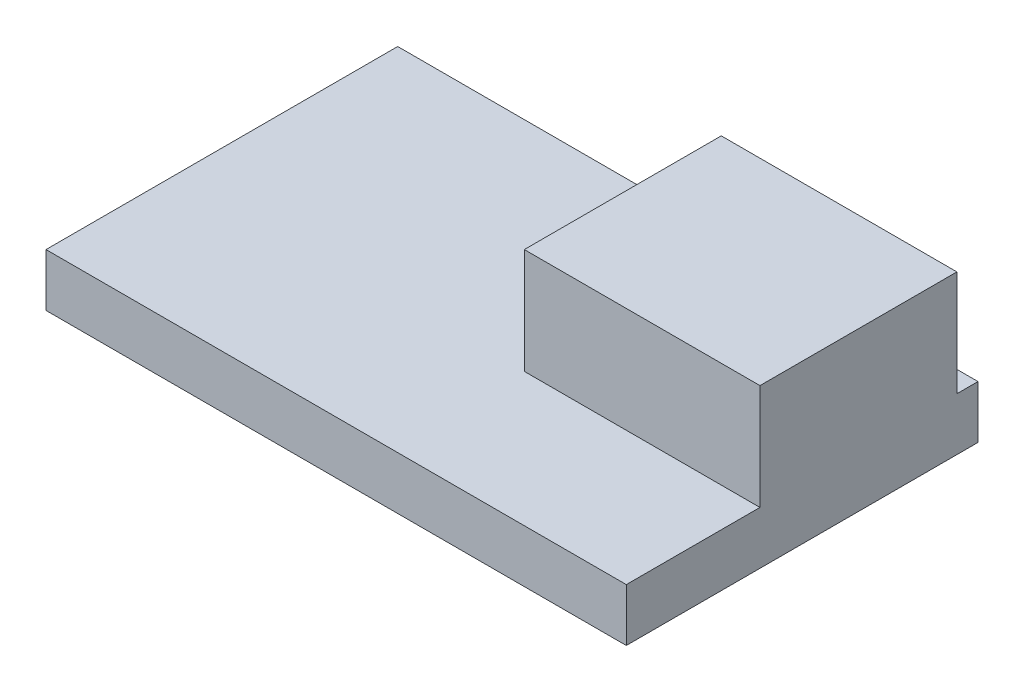
ISO-10303-21;
HEADER;
FILE_DESCRIPTION(('STEP AP214'),'2;1');
FILE_NAME('part.step','',(''),(''),'','','');
FILE_SCHEMA(('AUTOMOTIVE_DESIGN { 1 0 10303 214 1 1 1 1 }'));
ENDSEC;
DATA;
#1=APPLICATION_CONTEXT('core data for automotive mechanical design processes');
#2=APPLICATION_PROTOCOL_DEFINITION('international standard','automotive_design',2000,#1);
#3=PRODUCT_CONTEXT('',#1,'mechanical');
#4=PRODUCT('Part','Part','',(#3));
#5=PRODUCT_RELATED_PRODUCT_CATEGORY('part','',(#4));
#6=PRODUCT_DEFINITION_FORMATION('','',#4);
#7=PRODUCT_DEFINITION_CONTEXT('part definition',#1,'design');
#8=PRODUCT_DEFINITION('design','',#6,#7);
#9=PRODUCT_DEFINITION_SHAPE('','',#8);
#10=(LENGTH_UNIT() NAMED_UNIT(*) SI_UNIT(.MILLI.,.METRE.));
#11=(NAMED_UNIT(*) PLANE_ANGLE_UNIT() SI_UNIT($,.RADIAN.));
#12=(NAMED_UNIT(*) SI_UNIT($,.STERADIAN.) SOLID_ANGLE_UNIT());
#13=UNCERTAINTY_MEASURE_WITH_UNIT(LENGTH_MEASURE(1.E-05),#10,'distance_accuracy_value','');
#14=(GEOMETRIC_REPRESENTATION_CONTEXT(3) GLOBAL_UNCERTAINTY_ASSIGNED_CONTEXT((#13)) GLOBAL_UNIT_ASSIGNED_CONTEXT((#10,
#11,#12)) REPRESENTATION_CONTEXT('',''));
#15=CARTESIAN_POINT('',(0.,0.,0.));
#16=DIRECTION('',(0.,0.,1.));
#17=DIRECTION('',(1.,0.,0.));
#18=AXIS2_PLACEMENT_3D('',#15,#16,#17);
#19=CARTESIAN_POINT('',(-22.7791116446579,45.,-23.3733493397359));
#20=DIRECTION('',(1.,0.,0.));
#21=DIRECTION('',(0.,0.,-1.));
#22=AXIS2_PLACEMENT_3D('',#19,#20,#21);
#23=PLANE('',#22);
#24=DIRECTION('',(0.,0.,1.));
#25=VECTOR('',#24,1.);
#26=CARTESIAN_POINT('',(-22.7791116446579,15.,0.));
#27=LINE('',#26,#25);
#28=CARTESIAN_POINT('',(-22.7791116446579,15.,-23.3733493397359));
#29=VERTEX_POINT('',#28);
#30=CARTESIAN_POINT('',(-22.7791116446579,15.,76.6266506602641));
#31=VERTEX_POINT('',#30);
#32=EDGE_CURVE('E133',#29,#31,#27,.T.);
#33=ORIENTED_EDGE('',*,*,#32,.F.);
#34=DIRECTION('',(0.,-1.,0.));
#35=VECTOR('',#34,1.);
#36=CARTESIAN_POINT('',(-22.7791116446579,45.,-23.3733493397359));
#37=LINE('',#36,#35);
#38=CARTESIAN_POINT('',(-22.7791116446579,0.,-23.3733493397359));
#39=VERTEX_POINT('',#38);
#40=EDGE_CURVE('E60',#29,#39,#37,.T.);
#41=ORIENTED_EDGE('',*,*,#40,.T.);
#42=DIRECTION('',(0.,0.,1.));
#43=VECTOR('',#42,1.);
#44=CARTESIAN_POINT('',(-22.7791116446579,0.,-23.3733493397359));
#45=LINE('',#44,#43);
#46=CARTESIAN_POINT('',(-22.7791116446579,0.,76.6266506602641));
#47=VERTEX_POINT('',#46);
#48=EDGE_CURVE('E141',#39,#47,#45,.T.);
#49=ORIENTED_EDGE('',*,*,#48,.T.);
#50=DIRECTION('',(0.,-1.,0.));
#51=VECTOR('',#50,1.);
#52=CARTESIAN_POINT('',(-22.7791116446579,45.,76.6266506602641));
#53=LINE('',#52,#51);
#54=EDGE_CURVE('E11',#31,#47,#53,.T.);
#55=ORIENTED_EDGE('',*,*,#54,.F.);
#56=EDGE_LOOP('',(#33,#41,#49,#55));
#57=FACE_BOUND('',#56,.T.);
#58=ADVANCED_FACE('F38',(#57),#23,.F.);
#59=CARTESIAN_POINT('',(-22.7791116446579,45.,76.6266506602641));
#60=DIRECTION('',(0.,0.,-1.));
#61=DIRECTION('',(-1.,0.,0.));
#62=AXIS2_PLACEMENT_3D('',#59,#60,#61);
#63=PLANE('',#62);
#64=DIRECTION('',(1.,0.,0.));
#65=VECTOR('',#64,1.);
#66=CARTESIAN_POINT('',(0.,15.,76.6266506602641));
#67=LINE('',#66,#65);
#68=CARTESIAN_POINT('',(142.220888355342,15.,76.6266506602641));
#69=VERTEX_POINT('',#68);
#70=EDGE_CURVE('E135',#31,#69,#67,.T.);
#71=ORIENTED_EDGE('',*,*,#70,.F.);
#72=ORIENTED_EDGE('',*,*,#54,.T.);
#73=DIRECTION('',(1.,0.,0.));
#74=VECTOR('',#73,1.);
#75=CARTESIAN_POINT('',(-22.7791116446579,0.,76.6266506602641));
#76=LINE('',#75,#74);
#77=CARTESIAN_POINT('',(142.220888355342,0.,76.6266506602641));
#78=VERTEX_POINT('',#77);
#79=EDGE_CURVE('E151',#47,#78,#76,.T.);
#80=ORIENTED_EDGE('',*,*,#79,.T.);
#81=DIRECTION('',(0.,-1.,0.));
#82=VECTOR('',#81,1.);
#83=CARTESIAN_POINT('',(142.220888355342,45.,76.6266506602641));
#84=LINE('',#83,#82);
#85=EDGE_CURVE('E45',#69,#78,#84,.T.);
#86=ORIENTED_EDGE('',*,*,#85,.F.);
#87=EDGE_LOOP('',(#71,#72,#80,#86));
#88=FACE_BOUND('',#87,.T.);
#89=ADVANCED_FACE('F169',(#88),#63,.F.);
#90=CARTESIAN_POINT('',(142.220888355342,45.,-23.3733493397359));
#91=DIRECTION('',(-1.,0.,0.));
#92=DIRECTION('',(0.,0.,1.));
#93=AXIS2_PLACEMENT_3D('',#90,#91,#92);
#94=PLANE('',#93);
#95=DIRECTION('',(0.,1.,0.));
#96=VECTOR('',#95,1.);
#97=CARTESIAN_POINT('',(142.220888355342,15.,38.6266506602641));
#98=LINE('',#97,#96);
#99=CARTESIAN_POINT('',(142.220888355342,15.,38.6266506602641));
#100=VERTEX_POINT('',#99);
#101=CARTESIAN_POINT('',(142.220888355342,45.,38.6266506602641));
#102=VERTEX_POINT('',#101);
#103=EDGE_CURVE('E139',#100,#102,#98,.T.);
#104=ORIENTED_EDGE('',*,*,#103,.F.);
#105=DIRECTION('',(0.,0.,-1.));
#106=VECTOR('',#105,1.);
#107=CARTESIAN_POINT('',(142.220888355342,15.,0.));
#108=LINE('',#107,#106);
#109=EDGE_CURVE('E118',#69,#100,#108,.T.);
#110=ORIENTED_EDGE('',*,*,#109,.F.);
#111=ORIENTED_EDGE('',*,*,#85,.T.);
#112=DIRECTION('',(0.,0.,-1.));
#113=VECTOR('',#112,1.);
#114=CARTESIAN_POINT('',(142.220888355342,0.,-23.3733493397359));
#115=LINE('',#114,#113);
#116=CARTESIAN_POINT('',(142.220888355342,0.,-23.3733493397359));
#117=VERTEX_POINT('',#116);
#118=EDGE_CURVE('E154',#78,#117,#115,.T.);
#119=ORIENTED_EDGE('',*,*,#118,.T.);
#120=DIRECTION('',(0.,-1.,0.));
#121=VECTOR('',#120,1.);
#122=CARTESIAN_POINT('',(142.220888355342,45.,-23.3733493397359));
#123=LINE('',#122,#121);
#124=CARTESIAN_POINT('',(142.220888355342,15.,-23.3733493397359));
#125=VERTEX_POINT('',#124);
#126=EDGE_CURVE('E159',#125,#117,#123,.T.);
#127=ORIENTED_EDGE('',*,*,#126,.F.);
#128=CARTESIAN_POINT('',(142.220888355342,15.,-17.3733493397359));
#129=VERTEX_POINT('',#128);
#130=EDGE_CURVE('E129',#129,#125,#108,.T.);
#131=ORIENTED_EDGE('',*,*,#130,.F.);
#132=DIRECTION('',(0.,1.,0.));
#133=VECTOR('',#132,1.);
#134=CARTESIAN_POINT('',(142.220888355342,15.,-17.3733493397359));
#135=LINE('',#134,#133);
#136=CARTESIAN_POINT('',(142.220888355342,45.,-17.3733493397359));
#137=VERTEX_POINT('',#136);
#138=EDGE_CURVE('E142',#129,#137,#135,.T.);
#139=ORIENTED_EDGE('',*,*,#138,.T.);
#140=DIRECTION('',(0.,0.,-1.));
#141=VECTOR('',#140,1.);
#142=CARTESIAN_POINT('',(142.220888355342,45.,-23.3733493397359));
#143=LINE('',#142,#141);
#144=EDGE_CURVE('E146',#102,#137,#143,.T.);
#145=ORIENTED_EDGE('',*,*,#144,.F.);
#146=EDGE_LOOP('',(#104,#110,#111,#119,#127,#131,#139,#145));
#147=FACE_BOUND('',#146,.T.);
#148=ADVANCED_FACE('F162',(#147),#94,.F.);
#149=CARTESIAN_POINT('',(-22.7791116446579,45.,-23.3733493397359));
#150=DIRECTION('',(0.,0.,1.));
#151=DIRECTION('',(1.,0.,0.));
#152=AXIS2_PLACEMENT_3D('',#149,#150,#151);
#153=PLANE('',#152);
#154=DIRECTION('',(-1.,0.,0.));
#155=VECTOR('',#154,1.);
#156=CARTESIAN_POINT('',(0.,15.,-23.3733493397359));
#157=LINE('',#156,#155);
#158=EDGE_CURVE('E131',#125,#29,#157,.T.);
#159=ORIENTED_EDGE('',*,*,#158,.F.);
#160=ORIENTED_EDGE('',*,*,#126,.T.);
#161=DIRECTION('',(-1.,0.,0.));
#162=VECTOR('',#161,1.);
#163=CARTESIAN_POINT('',(-22.7791116446579,0.,-23.3733493397359));
#164=LINE('',#163,#162);
#165=EDGE_CURVE('E149',#117,#39,#164,.T.);
#166=ORIENTED_EDGE('',*,*,#165,.T.);
#167=ORIENTED_EDGE('',*,*,#40,.F.);
#168=EDGE_LOOP('',(#159,#160,#166,#167));
#169=FACE_BOUND('',#168,.T.);
#170=ADVANCED_FACE('F176',(#169),#153,.F.);
#171=CARTESIAN_POINT('',(0.,45.,0.));
#172=DIRECTION('',(0.,1.,0.));
#173=DIRECTION('',(0.,0.,1.));
#174=AXIS2_PLACEMENT_3D('',#171,#172,#173);
#175=PLANE('',#174);
#176=DIRECTION('',(0.,0.,1.));
#177=VECTOR('',#176,1.);
#178=CARTESIAN_POINT('',(75.2208883553421,45.,0.));
#179=LINE('',#178,#177);
#180=CARTESIAN_POINT('',(75.2208883553421,45.,-17.3733493397359));
#181=VERTEX_POINT('',#180);
#182=CARTESIAN_POINT('',(75.2208883553421,45.,38.6266506602641));
#183=VERTEX_POINT('',#182);
#184=EDGE_CURVE('E125',#181,#183,#179,.T.);
#185=ORIENTED_EDGE('',*,*,#184,.T.);
#186=DIRECTION('',(1.,0.,0.));
#187=VECTOR('',#186,1.);
#188=CARTESIAN_POINT('',(0.,45.,38.6266506602641));
#189=LINE('',#188,#187);
#190=EDGE_CURVE('E52',#183,#102,#189,.T.);
#191=ORIENTED_EDGE('',*,*,#190,.T.);
#192=ORIENTED_EDGE('',*,*,#144,.T.);
#193=DIRECTION('',(1.,0.,0.));
#194=VECTOR('',#193,1.);
#195=CARTESIAN_POINT('',(0.,45.,-17.3733493397359));
#196=LINE('',#195,#194);
#197=EDGE_CURVE('E123',#181,#137,#196,.T.);
#198=ORIENTED_EDGE('',*,*,#197,.F.);
#199=EDGE_LOOP('',(#185,#191,#192,#198));
#200=FACE_BOUND('',#199,.T.);
#201=ADVANCED_FACE('F183',(#200),#175,.T.);
#202=CARTESIAN_POINT('',(0.,0.,0.));
#203=DIRECTION('',(0.,1.,0.));
#204=DIRECTION('',(0.,0.,1.));
#205=AXIS2_PLACEMENT_3D('',#202,#203,#204);
#206=PLANE('',#205);
#207=ORIENTED_EDGE('',*,*,#48,.F.);
#208=ORIENTED_EDGE('',*,*,#165,.F.);
#209=ORIENTED_EDGE('',*,*,#118,.F.);
#210=ORIENTED_EDGE('',*,*,#79,.F.);
#211=EDGE_LOOP('',(#207,#208,#209,#210));
#212=FACE_BOUND('',#211,.T.);
#213=ADVANCED_FACE('F173',(#212),#206,.F.);
#214=CARTESIAN_POINT('',(0.,15.,38.6266506602641));
#215=DIRECTION('',(0.,0.,1.));
#216=DIRECTION('',(1.,0.,0.));
#217=AXIS2_PLACEMENT_3D('',#214,#215,#216);
#218=PLANE('',#217);
#219=ORIENTED_EDGE('',*,*,#190,.F.);
#220=DIRECTION('',(0.,1.,0.));
#221=VECTOR('',#220,1.);
#222=CARTESIAN_POINT('',(75.2208883553421,15.,38.6266506602641));
#223=LINE('',#222,#221);
#224=CARTESIAN_POINT('',(75.2208883553421,15.,38.6266506602641));
#225=VERTEX_POINT('',#224);
#226=EDGE_CURVE('E106',#225,#183,#223,.T.);
#227=ORIENTED_EDGE('',*,*,#226,.F.);
#228=DIRECTION('',(1.,0.,0.));
#229=VECTOR('',#228,1.);
#230=CARTESIAN_POINT('',(0.,15.,38.6266506602641));
#231=LINE('',#230,#229);
#232=EDGE_CURVE('E114',#225,#100,#231,.T.);
#233=ORIENTED_EDGE('',*,*,#232,.T.);
#234=ORIENTED_EDGE('',*,*,#103,.T.);
#235=EDGE_LOOP('',(#219,#227,#233,#234));
#236=FACE_BOUND('',#235,.T.);
#237=ADVANCED_FACE('F116',(#236),#218,.T.);
#238=CARTESIAN_POINT('',(0.,15.,-17.3733493397359));
#239=DIRECTION('',(0.,0.,1.));
#240=DIRECTION('',(1.,0.,0.));
#241=AXIS2_PLACEMENT_3D('',#238,#239,#240);
#242=PLANE('',#241);
#243=ORIENTED_EDGE('',*,*,#197,.T.);
#244=ORIENTED_EDGE('',*,*,#138,.F.);
#245=DIRECTION('',(1.,0.,0.));
#246=VECTOR('',#245,1.);
#247=CARTESIAN_POINT('',(0.,15.,-17.3733493397359));
#248=LINE('',#247,#246);
#249=CARTESIAN_POINT('',(75.2208883553421,15.,-17.3733493397359));
#250=VERTEX_POINT('',#249);
#251=EDGE_CURVE('E113',#250,#129,#248,.T.);
#252=ORIENTED_EDGE('',*,*,#251,.F.);
#253=DIRECTION('',(0.,1.,0.));
#254=VECTOR('',#253,1.);
#255=CARTESIAN_POINT('',(75.2208883553421,15.,-17.3733493397359));
#256=LINE('',#255,#254);
#257=EDGE_CURVE('E108',#250,#181,#256,.T.);
#258=ORIENTED_EDGE('',*,*,#257,.T.);
#259=EDGE_LOOP('',(#243,#244,#252,#258));
#260=FACE_BOUND('',#259,.T.);
#261=ADVANCED_FACE('F180',(#260),#242,.F.);
#262=CARTESIAN_POINT('',(75.2208883553421,15.,0.));
#263=DIRECTION('',(-1.,0.,0.));
#264=DIRECTION('',(0.,0.,1.));
#265=AXIS2_PLACEMENT_3D('',#262,#263,#264);
#266=PLANE('',#265);
#267=ORIENTED_EDGE('',*,*,#184,.F.);
#268=ORIENTED_EDGE('',*,*,#257,.F.);
#269=DIRECTION('',(0.,0.,1.));
#270=VECTOR('',#269,1.);
#271=CARTESIAN_POINT('',(75.2208883553421,15.,0.));
#272=LINE('',#271,#270);
#273=EDGE_CURVE('E103',#250,#225,#272,.T.);
#274=ORIENTED_EDGE('',*,*,#273,.T.);
#275=ORIENTED_EDGE('',*,*,#226,.T.);
#276=EDGE_LOOP('',(#267,#268,#274,#275));
#277=FACE_BOUND('',#276,.T.);
#278=ADVANCED_FACE('F105',(#277),#266,.T.);
#279=CARTESIAN_POINT('',(0.,15.,0.));
#280=DIRECTION('',(0.,1.,0.));
#281=DIRECTION('',(0.,0.,1.));
#282=AXIS2_PLACEMENT_3D('',#279,#280,#281);
#283=PLANE('',#282);
#284=ORIENTED_EDGE('',*,*,#232,.F.);
#285=ORIENTED_EDGE('',*,*,#273,.F.);
#286=ORIENTED_EDGE('',*,*,#251,.T.);
#287=ORIENTED_EDGE('',*,*,#130,.T.);
#288=ORIENTED_EDGE('',*,*,#158,.T.);
#289=ORIENTED_EDGE('',*,*,#32,.T.);
#290=ORIENTED_EDGE('',*,*,#70,.T.);
#291=ORIENTED_EDGE('',*,*,#109,.T.);
#292=EDGE_LOOP('',(#284,#285,#286,#287,#288,#289,#290,#291));
#293=FACE_BOUND('',#292,.T.);
#294=ADVANCED_FACE('F120',(#293),#283,.T.);
#295=CLOSED_SHELL('',(#58,#89,#148,#170,#201,#213,#237,#261,#278,#294));
#296=MANIFOLD_SOLID_BREP('B2',#295);
#297=ADVANCED_BREP_SHAPE_REPRESENTATION('',(#18,#296),#14);
#298=SHAPE_DEFINITION_REPRESENTATION(#9,#297);
ENDSEC;
END-ISO-10303-21;
